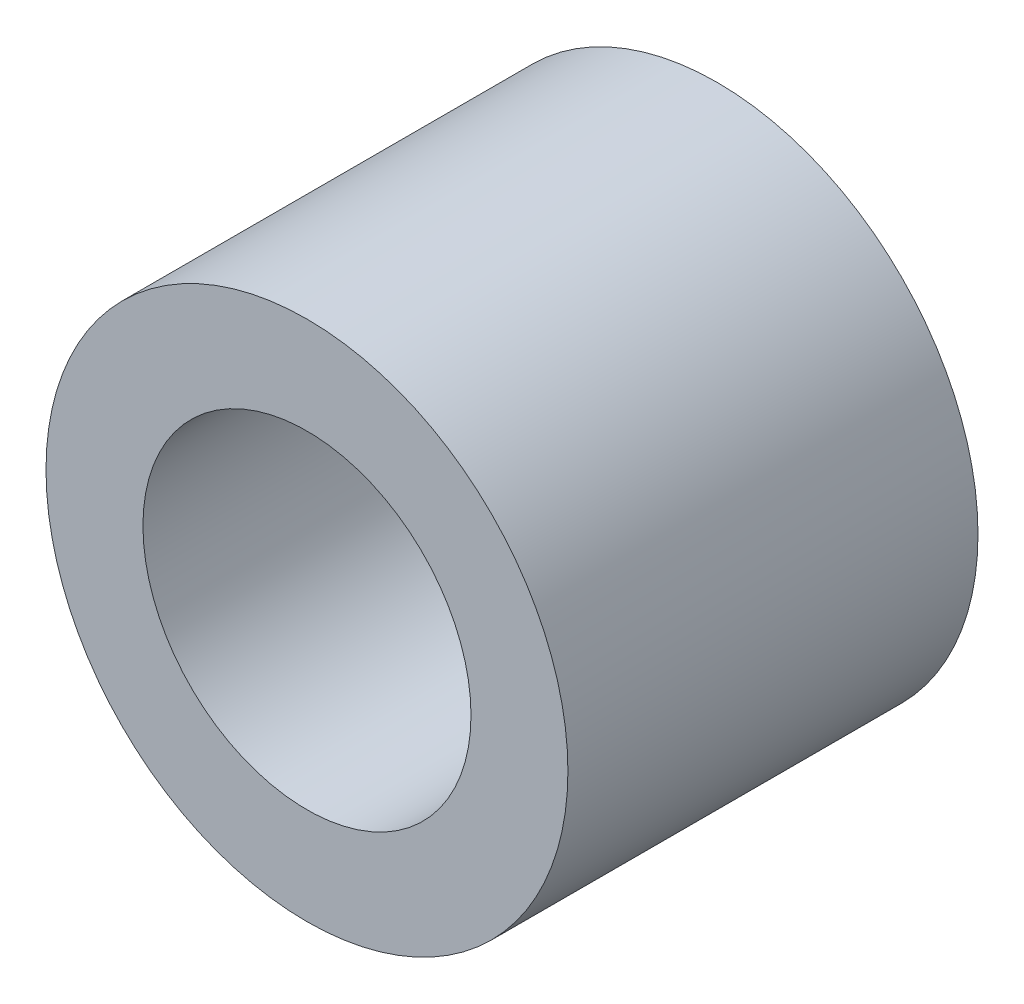
ISO-10303-21;
HEADER;
FILE_DESCRIPTION(('STEP AP214'),'2;1');
FILE_NAME('part.step','',(''),(''),'','','');
FILE_SCHEMA(('AUTOMOTIVE_DESIGN { 1 0 10303 214 1 1 1 1 }'));
ENDSEC;
DATA;
#1=APPLICATION_CONTEXT('core data for automotive mechanical design processes');
#2=APPLICATION_PROTOCOL_DEFINITION('international standard','automotive_design',2000,#1);
#3=PRODUCT_CONTEXT('',#1,'mechanical');
#4=PRODUCT('Part','Part','',(#3));
#5=PRODUCT_RELATED_PRODUCT_CATEGORY('part','',(#4));
#6=PRODUCT_DEFINITION_FORMATION('','',#4);
#7=PRODUCT_DEFINITION_CONTEXT('part definition',#1,'design');
#8=PRODUCT_DEFINITION('design','',#6,#7);
#9=PRODUCT_DEFINITION_SHAPE('','',#8);
#10=(LENGTH_UNIT() NAMED_UNIT(*) SI_UNIT(.MILLI.,.METRE.));
#11=(NAMED_UNIT(*) PLANE_ANGLE_UNIT() SI_UNIT($,.RADIAN.));
#12=(NAMED_UNIT(*) SI_UNIT($,.STERADIAN.) SOLID_ANGLE_UNIT());
#13=UNCERTAINTY_MEASURE_WITH_UNIT(LENGTH_MEASURE(1.E-05),#10,'distance_accuracy_value','');
#14=(GEOMETRIC_REPRESENTATION_CONTEXT(3) GLOBAL_UNCERTAINTY_ASSIGNED_CONTEXT((#13)) GLOBAL_UNIT_ASSIGNED_CONTEXT((#10,
#11,#12)) REPRESENTATION_CONTEXT('',''));
#15=CARTESIAN_POINT('',(0.,0.,0.));
#16=DIRECTION('',(0.,0.,1.));
#17=DIRECTION('',(1.,0.,0.));
#18=AXIS2_PLACEMENT_3D('',#15,#16,#17);
#19=CARTESIAN_POINT('',(0.,0.,11.));
#20=DIRECTION('',(0.,0.,1.));
#21=DIRECTION('',(1.,0.,0.));
#22=AXIS2_PLACEMENT_3D('',#19,#20,#21);
#23=PLANE('',#22);
#24=CARTESIAN_POINT('',(0.,0.,11.));
#25=DIRECTION('',(0.,0.,1.));
#26=DIRECTION('',(1.,0.,0.));
#27=AXIS2_PLACEMENT_3D('',#24,#25,#26);
#28=CIRCLE('',#27,7.);
#29=CARTESIAN_POINT('',(7.,0.,11.));
#30=VERTEX_POINT('',#29);
#31=EDGE_CURVE('E10',#30,#30,#28,.T.);
#32=ORIENTED_EDGE('',*,*,#31,.T.);
#33=EDGE_LOOP('',(#32));
#34=FACE_BOUND('',#33,.T.);
#35=CARTESIAN_POINT('',(0.,0.,11.));
#36=DIRECTION('',(0.,0.,1.));
#37=DIRECTION('',(1.,0.,0.));
#38=AXIS2_PLACEMENT_3D('',#35,#36,#37);
#39=CIRCLE('',#38,4.4);
#40=CARTESIAN_POINT('',(4.4,0.,11.));
#41=VERTEX_POINT('',#40);
#42=EDGE_CURVE('E50',#41,#41,#39,.T.);
#43=ORIENTED_EDGE('',*,*,#42,.F.);
#44=EDGE_LOOP('',(#43));
#45=FACE_BOUND('',#44,.T.);
#46=ADVANCED_FACE('F37',(#34,#45),#23,.T.);
#47=CARTESIAN_POINT('',(0.,0.,0.));
#48=DIRECTION('',(0.,0.,1.));
#49=DIRECTION('',(1.,0.,0.));
#50=AXIS2_PLACEMENT_3D('',#47,#48,#49);
#51=PLANE('',#50);
#52=CARTESIAN_POINT('',(0.,0.,0.));
#53=DIRECTION('',(0.,0.,1.));
#54=DIRECTION('',(1.,0.,0.));
#55=AXIS2_PLACEMENT_3D('',#52,#53,#54);
#56=CIRCLE('',#55,7.);
#57=CARTESIAN_POINT('',(7.,0.,0.));
#58=VERTEX_POINT('',#57);
#59=EDGE_CURVE('E41',#58,#58,#56,.T.);
#60=ORIENTED_EDGE('',*,*,#59,.F.);
#61=EDGE_LOOP('',(#60));
#62=FACE_BOUND('',#61,.T.);
#63=CARTESIAN_POINT('',(0.,0.,0.));
#64=DIRECTION('',(0.,0.,1.));
#65=DIRECTION('',(1.,0.,0.));
#66=AXIS2_PLACEMENT_3D('',#63,#64,#65);
#67=CIRCLE('',#66,4.4);
#68=CARTESIAN_POINT('',(4.4,0.,0.));
#69=VERTEX_POINT('',#68);
#70=EDGE_CURVE('E52',#69,#69,#67,.T.);
#71=ORIENTED_EDGE('',*,*,#70,.T.);
#72=EDGE_LOOP('',(#71));
#73=FACE_BOUND('',#72,.T.);
#74=ADVANCED_FACE('F64',(#62,#73),#51,.F.);
#75=CARTESIAN_POINT('',(0.,0.,11.));
#76=DIRECTION('',(0.,0.,-1.));
#77=DIRECTION('',(-1.,0.,0.));
#78=AXIS2_PLACEMENT_3D('',#75,#76,#77);
#79=CYLINDRICAL_SURFACE('',#78,7.);
#80=ORIENTED_EDGE('',*,*,#31,.F.);
#81=EDGE_LOOP('',(#80));
#82=FACE_BOUND('',#81,.T.);
#83=ORIENTED_EDGE('',*,*,#59,.T.);
#84=EDGE_LOOP('',(#83));
#85=FACE_BOUND('',#84,.T.);
#86=ADVANCED_FACE('F39',(#82,#85),#79,.T.);
#87=CARTESIAN_POINT('',(0.,0.,11.));
#88=DIRECTION('',(0.,0.,-1.));
#89=DIRECTION('',(-1.,0.,0.));
#90=AXIS2_PLACEMENT_3D('',#87,#88,#89);
#91=CYLINDRICAL_SURFACE('',#90,4.4);
#92=ORIENTED_EDGE('',*,*,#42,.T.);
#93=EDGE_LOOP('',(#92));
#94=FACE_BOUND('',#93,.T.);
#95=ORIENTED_EDGE('',*,*,#70,.F.);
#96=EDGE_LOOP('',(#95));
#97=FACE_BOUND('',#96,.T.);
#98=ADVANCED_FACE('F60',(#94,#97),#91,.F.);
#99=CLOSED_SHELL('',(#46,#74,#86,#98));
#100=MANIFOLD_SOLID_BREP('B2',#99);
#101=ADVANCED_BREP_SHAPE_REPRESENTATION('',(#18,#100),#14);
#102=SHAPE_DEFINITION_REPRESENTATION(#9,#101);
ENDSEC;
END-ISO-10303-21;
